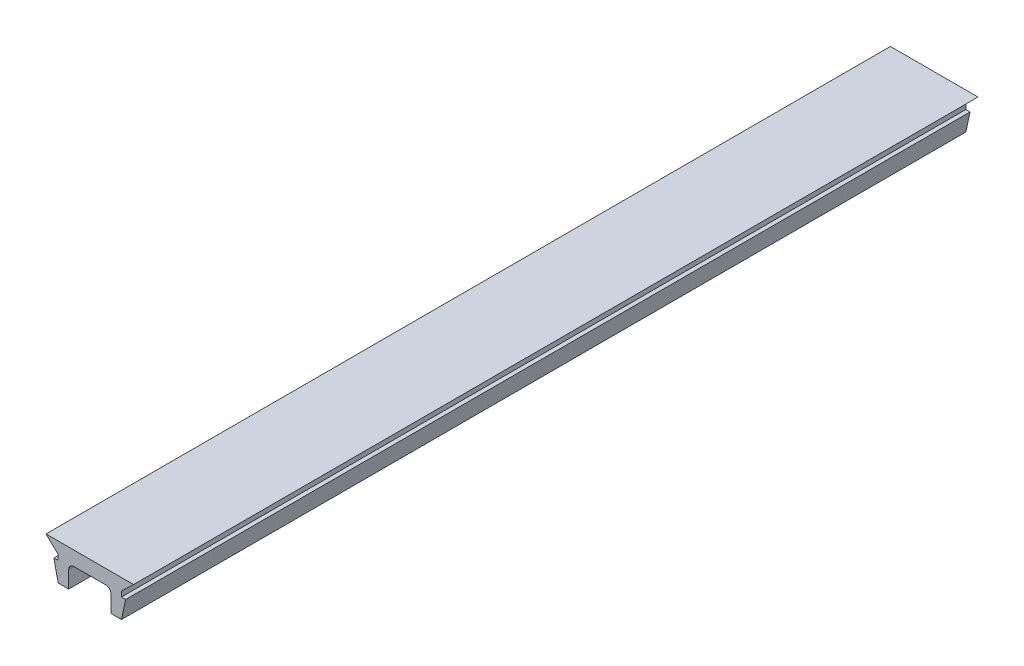
ISO-10303-21;
HEADER;
FILE_DESCRIPTION(('STEP AP214'),'2;1');
FILE_NAME('part.step','',(''),(''),'','','');
FILE_SCHEMA(('AUTOMOTIVE_DESIGN { 1 0 10303 214 1 1 1 1 }'));
ENDSEC;
DATA;
#1=APPLICATION_CONTEXT('core data for automotive mechanical design processes');
#2=APPLICATION_PROTOCOL_DEFINITION('international standard','automotive_design',2000,#1);
#3=PRODUCT_CONTEXT('',#1,'mechanical');
#4=PRODUCT('Part','Part','',(#3));
#5=PRODUCT_RELATED_PRODUCT_CATEGORY('part','',(#4));
#6=PRODUCT_DEFINITION_FORMATION('','',#4);
#7=PRODUCT_DEFINITION_CONTEXT('part definition',#1,'design');
#8=PRODUCT_DEFINITION('design','',#6,#7);
#9=PRODUCT_DEFINITION_SHAPE('','',#8);
#10=(LENGTH_UNIT() NAMED_UNIT(*) SI_UNIT(.MILLI.,.METRE.));
#11=(NAMED_UNIT(*) PLANE_ANGLE_UNIT() SI_UNIT($,.RADIAN.));
#12=(NAMED_UNIT(*) SI_UNIT($,.STERADIAN.) SOLID_ANGLE_UNIT());
#13=UNCERTAINTY_MEASURE_WITH_UNIT(LENGTH_MEASURE(1.E-05),#10,'distance_accuracy_value','');
#14=(GEOMETRIC_REPRESENTATION_CONTEXT(3) GLOBAL_UNCERTAINTY_ASSIGNED_CONTEXT((#13)) GLOBAL_UNIT_ASSIGNED_CONTEXT((#10,
#11,#12)) REPRESENTATION_CONTEXT('',''));
#15=CARTESIAN_POINT('',(0.,0.,0.));
#16=DIRECTION('',(0.,0.,1.));
#17=DIRECTION('',(1.,0.,0.));
#18=AXIS2_PLACEMENT_3D('',#15,#16,#17);
#19=CARTESIAN_POINT('',(-0.4,1.85,80.));
#20=DIRECTION('',(0.977414165439867,0.211332792527539,0.));
#21=DIRECTION('',(-0.211332792527539,0.977414165439867,0.));
#22=AXIS2_PLACEMENT_3D('',#19,#20,#21);
#23=PLANE('',#22);
#24=DIRECTION('',(0.211332792527539,-0.977414165439867,0.));
#25=VECTOR('',#24,1.);
#26=CARTESIAN_POINT('',(-0.4,1.85,0.));
#27=LINE('',#26,#25);
#28=CARTESIAN_POINT('',(-0.4,1.85,0.));
#29=VERTEX_POINT('',#28);
#30=CARTESIAN_POINT('',(0.,0.,0.));
#31=VERTEX_POINT('',#30);
#32=EDGE_CURVE('E188',#29,#31,#27,.T.);
#33=ORIENTED_EDGE('',*,*,#32,.T.);
#34=DIRECTION('',(0.,0.,-1.));
#35=VECTOR('',#34,1.);
#36=CARTESIAN_POINT('',(0.,0.,80.));
#37=LINE('',#36,#35);
#38=CARTESIAN_POINT('',(0.,0.,80.));
#39=VERTEX_POINT('',#38);
#40=EDGE_CURVE('E11',#39,#31,#37,.T.);
#41=ORIENTED_EDGE('',*,*,#40,.F.);
#42=DIRECTION('',(0.211332792527539,-0.977414165439867,0.));
#43=VECTOR('',#42,1.);
#44=CARTESIAN_POINT('',(-0.4,1.85,80.));
#45=LINE('',#44,#43);
#46=CARTESIAN_POINT('',(-0.4,1.85,80.));
#47=VERTEX_POINT('',#46);
#48=EDGE_CURVE('E235',#47,#39,#45,.T.);
#49=ORIENTED_EDGE('',*,*,#48,.F.);
#50=DIRECTION('',(0.,0.,-1.));
#51=VECTOR('',#50,1.);
#52=CARTESIAN_POINT('',(-0.4,1.85,80.));
#53=LINE('',#52,#51);
#54=EDGE_CURVE('E184',#47,#29,#53,.T.);
#55=ORIENTED_EDGE('',*,*,#54,.T.);
#56=EDGE_LOOP('',(#33,#41,#49,#55));
#57=FACE_BOUND('',#56,.T.);
#58=ADVANCED_FACE('F39',(#57),#23,.F.);
#59=CARTESIAN_POINT('',(0.,0.,80.));
#60=DIRECTION('',(0.,1.,0.));
#61=DIRECTION('',(0.,0.,1.));
#62=AXIS2_PLACEMENT_3D('',#59,#60,#61);
#63=PLANE('',#62);
#64=DIRECTION('',(1.,0.,0.));
#65=VECTOR('',#64,1.);
#66=CARTESIAN_POINT('',(0.,0.,0.));
#67=LINE('',#66,#65);
#68=CARTESIAN_POINT('',(1.,0.,0.));
#69=VERTEX_POINT('',#68);
#70=EDGE_CURVE('E192',#31,#69,#67,.T.);
#71=ORIENTED_EDGE('',*,*,#70,.T.);
#72=DIRECTION('',(0.,0.,-1.));
#73=VECTOR('',#72,1.);
#74=CARTESIAN_POINT('',(1.,0.,80.));
#75=LINE('',#74,#73);
#76=CARTESIAN_POINT('',(1.,0.,80.));
#77=VERTEX_POINT('',#76);
#78=EDGE_CURVE('E48',#77,#69,#75,.T.);
#79=ORIENTED_EDGE('',*,*,#78,.F.);
#80=DIRECTION('',(1.,0.,0.));
#81=VECTOR('',#80,1.);
#82=CARTESIAN_POINT('',(0.,0.,80.));
#83=LINE('',#82,#81);
#84=EDGE_CURVE('E123',#39,#77,#83,.T.);
#85=ORIENTED_EDGE('',*,*,#84,.F.);
#86=ORIENTED_EDGE('',*,*,#40,.T.);
#87=EDGE_LOOP('',(#71,#79,#85,#86));
#88=FACE_BOUND('',#87,.T.);
#89=ADVANCED_FACE('F356',(#88),#63,.F.);
#90=CARTESIAN_POINT('',(1.,0.,80.));
#91=DIRECTION('',(-1.,0.,0.));
#92=DIRECTION('',(0.,0.,1.));
#93=AXIS2_PLACEMENT_3D('',#90,#91,#92);
#94=PLANE('',#93);
#95=DIRECTION('',(0.,1.,0.));
#96=VECTOR('',#95,1.);
#97=CARTESIAN_POINT('',(1.,0.,0.));
#98=LINE('',#97,#96);
#99=CARTESIAN_POINT('',(1.,1.6,0.));
#100=VERTEX_POINT('',#99);
#101=EDGE_CURVE('E195',#69,#100,#98,.T.);
#102=ORIENTED_EDGE('',*,*,#101,.T.);
#103=DIRECTION('',(0.,0.,-1.));
#104=VECTOR('',#103,1.);
#105=CARTESIAN_POINT('',(1.,1.6,80.));
#106=LINE('',#105,#104);
#107=CARTESIAN_POINT('',(1.,1.6,80.));
#108=VERTEX_POINT('',#107);
#109=EDGE_CURVE('E278',#108,#100,#106,.T.);
#110=ORIENTED_EDGE('',*,*,#109,.F.);
#111=DIRECTION('',(0.,1.,0.));
#112=VECTOR('',#111,1.);
#113=CARTESIAN_POINT('',(1.,0.,80.));
#114=LINE('',#113,#112);
#115=EDGE_CURVE('E288',#77,#108,#114,.T.);
#116=ORIENTED_EDGE('',*,*,#115,.F.);
#117=ORIENTED_EDGE('',*,*,#78,.T.);
#118=EDGE_LOOP('',(#102,#110,#116,#117));
#119=FACE_BOUND('',#118,.T.);
#120=ADVANCED_FACE('F286',(#119),#94,.F.);
#121=CARTESIAN_POINT('',(1.5,1.6,80.));
#122=DIRECTION('',(0.,0.,-1.));
#123=DIRECTION('',(-1.,0.,0.));
#124=AXIS2_PLACEMENT_3D('',#121,#122,#123);
#125=CYLINDRICAL_SURFACE('',#124,0.5);
#126=CARTESIAN_POINT('',(1.5,1.6,0.));
#127=DIRECTION('',(0.,0.,-1.));
#128=DIRECTION('',(1.,0.,0.));
#129=AXIS2_PLACEMENT_3D('',#126,#127,#128);
#130=CIRCLE('',#129,0.5);
#131=CARTESIAN_POINT('',(1.5,2.1,0.));
#132=VERTEX_POINT('',#131);
#133=EDGE_CURVE('E198',#100,#132,#130,.T.);
#134=ORIENTED_EDGE('',*,*,#133,.T.);
#135=DIRECTION('',(0.,0.,-1.));
#136=VECTOR('',#135,1.);
#137=CARTESIAN_POINT('',(1.5,2.1,80.));
#138=LINE('',#137,#136);
#139=CARTESIAN_POINT('',(1.5,2.1,80.));
#140=VERTEX_POINT('',#139);
#141=EDGE_CURVE('E274',#140,#132,#138,.T.);
#142=ORIENTED_EDGE('',*,*,#141,.F.);
#143=CARTESIAN_POINT('',(1.5,1.6,80.));
#144=DIRECTION('',(0.,0.,-1.));
#145=DIRECTION('',(1.,0.,0.));
#146=AXIS2_PLACEMENT_3D('',#143,#144,#145);
#147=CIRCLE('',#146,0.5);
#148=EDGE_CURVE('E307',#108,#140,#147,.T.);
#149=ORIENTED_EDGE('',*,*,#148,.F.);
#150=ORIENTED_EDGE('',*,*,#109,.T.);
#151=EDGE_LOOP('',(#134,#142,#149,#150));
#152=FACE_BOUND('',#151,.T.);
#153=ADVANCED_FACE('F297',(#152),#125,.F.);
#154=CARTESIAN_POINT('',(1.5,2.1,80.));
#155=DIRECTION('',(0.,1.,0.));
#156=DIRECTION('',(0.,0.,1.));
#157=AXIS2_PLACEMENT_3D('',#154,#155,#156);
#158=PLANE('',#157);
#159=DIRECTION('',(1.,0.,0.));
#160=VECTOR('',#159,1.);
#161=CARTESIAN_POINT('',(1.5,2.1,0.));
#162=LINE('',#161,#160);
#163=CARTESIAN_POINT('',(4.5,2.1,0.));
#164=VERTEX_POINT('',#163);
#165=EDGE_CURVE('E201',#132,#164,#162,.T.);
#166=ORIENTED_EDGE('',*,*,#165,.T.);
#167=DIRECTION('',(0.,0.,-1.));
#168=VECTOR('',#167,1.);
#169=CARTESIAN_POINT('',(4.5,2.1,80.));
#170=LINE('',#169,#168);
#171=CARTESIAN_POINT('',(4.5,2.1,80.));
#172=VERTEX_POINT('',#171);
#173=EDGE_CURVE('E270',#172,#164,#170,.T.);
#174=ORIENTED_EDGE('',*,*,#173,.F.);
#175=DIRECTION('',(1.,0.,0.));
#176=VECTOR('',#175,1.);
#177=CARTESIAN_POINT('',(1.5,2.1,80.));
#178=LINE('',#177,#176);
#179=EDGE_CURVE('E303',#140,#172,#178,.T.);
#180=ORIENTED_EDGE('',*,*,#179,.F.);
#181=ORIENTED_EDGE('',*,*,#141,.T.);
#182=EDGE_LOOP('',(#166,#174,#180,#181));
#183=FACE_BOUND('',#182,.T.);
#184=ADVANCED_FACE('F301',(#183),#158,.F.);
#185=CARTESIAN_POINT('',(4.5,1.6,80.));
#186=DIRECTION('',(0.,0.,-1.));
#187=DIRECTION('',(-1.,0.,0.));
#188=AXIS2_PLACEMENT_3D('',#185,#186,#187);
#189=CYLINDRICAL_SURFACE('',#188,0.5);
#190=CARTESIAN_POINT('',(4.5,1.6,0.));
#191=DIRECTION('',(0.,0.,-1.));
#192=DIRECTION('',(-1.,0.,0.));
#193=AXIS2_PLACEMENT_3D('',#190,#191,#192);
#194=CIRCLE('',#193,0.5);
#195=CARTESIAN_POINT('',(5.,1.6,0.));
#196=VERTEX_POINT('',#195);
#197=EDGE_CURVE('E204',#164,#196,#194,.T.);
#198=ORIENTED_EDGE('',*,*,#197,.T.);
#199=DIRECTION('',(0.,0.,-1.));
#200=VECTOR('',#199,1.);
#201=CARTESIAN_POINT('',(5.,1.6,80.));
#202=LINE('',#201,#200);
#203=CARTESIAN_POINT('',(5.,1.6,80.));
#204=VERTEX_POINT('',#203);
#205=EDGE_CURVE('E266',#204,#196,#202,.T.);
#206=ORIENTED_EDGE('',*,*,#205,.F.);
#207=CARTESIAN_POINT('',(4.5,1.6,80.));
#208=DIRECTION('',(0.,0.,-1.));
#209=DIRECTION('',(-1.,0.,0.));
#210=AXIS2_PLACEMENT_3D('',#207,#208,#209);
#211=CIRCLE('',#210,0.5);
#212=EDGE_CURVE('E306',#172,#204,#211,.T.);
#213=ORIENTED_EDGE('',*,*,#212,.F.);
#214=ORIENTED_EDGE('',*,*,#173,.T.);
#215=EDGE_LOOP('',(#198,#206,#213,#214));
#216=FACE_BOUND('',#215,.T.);
#217=ADVANCED_FACE('F369',(#216),#189,.F.);
#218=CARTESIAN_POINT('',(5.,0.,80.));
#219=DIRECTION('',(1.,0.,0.));
#220=DIRECTION('',(0.,0.,-1.));
#221=AXIS2_PLACEMENT_3D('',#218,#219,#220);
#222=PLANE('',#221);
#223=DIRECTION('',(0.,-1.,0.));
#224=VECTOR('',#223,1.);
#225=CARTESIAN_POINT('',(5.,0.,0.));
#226=LINE('',#225,#224);
#227=CARTESIAN_POINT('',(5.,0.,0.));
#228=VERTEX_POINT('',#227);
#229=EDGE_CURVE('E207',#196,#228,#226,.T.);
#230=ORIENTED_EDGE('',*,*,#229,.T.);
#231=DIRECTION('',(0.,0.,-1.));
#232=VECTOR('',#231,1.);
#233=CARTESIAN_POINT('',(5.,0.,80.));
#234=LINE('',#233,#232);
#235=CARTESIAN_POINT('',(5.,0.,80.));
#236=VERTEX_POINT('',#235);
#237=EDGE_CURVE('E262',#236,#228,#234,.T.);
#238=ORIENTED_EDGE('',*,*,#237,.F.);
#239=DIRECTION('',(0.,-1.,0.));
#240=VECTOR('',#239,1.);
#241=CARTESIAN_POINT('',(5.,0.,80.));
#242=LINE('',#241,#240);
#243=EDGE_CURVE('E311',#204,#236,#242,.T.);
#244=ORIENTED_EDGE('',*,*,#243,.F.);
#245=ORIENTED_EDGE('',*,*,#205,.T.);
#246=EDGE_LOOP('',(#230,#238,#244,#245));
#247=FACE_BOUND('',#246,.T.);
#248=ADVANCED_FACE('F372',(#247),#222,.F.);
#249=CARTESIAN_POINT('',(5.,0.,80.));
#250=DIRECTION('',(0.,1.,0.));
#251=DIRECTION('',(0.,0.,1.));
#252=AXIS2_PLACEMENT_3D('',#249,#250,#251);
#253=PLANE('',#252);
#254=DIRECTION('',(1.,0.,0.));
#255=VECTOR('',#254,1.);
#256=CARTESIAN_POINT('',(5.,0.,0.));
#257=LINE('',#256,#255);
#258=CARTESIAN_POINT('',(6.,0.,0.));
#259=VERTEX_POINT('',#258);
#260=EDGE_CURVE('E210',#228,#259,#257,.T.);
#261=ORIENTED_EDGE('',*,*,#260,.T.);
#262=DIRECTION('',(0.,0.,-1.));
#263=VECTOR('',#262,1.);
#264=CARTESIAN_POINT('',(6.,0.,80.));
#265=LINE('',#264,#263);
#266=CARTESIAN_POINT('',(6.,0.,80.));
#267=VERTEX_POINT('',#266);
#268=EDGE_CURVE('E258',#267,#259,#265,.T.);
#269=ORIENTED_EDGE('',*,*,#268,.F.);
#270=DIRECTION('',(1.,0.,0.));
#271=VECTOR('',#270,1.);
#272=CARTESIAN_POINT('',(5.,0.,80.));
#273=LINE('',#272,#271);
#274=EDGE_CURVE('E318',#236,#267,#273,.T.);
#275=ORIENTED_EDGE('',*,*,#274,.F.);
#276=ORIENTED_EDGE('',*,*,#237,.T.);
#277=EDGE_LOOP('',(#261,#269,#275,#276));
#278=FACE_BOUND('',#277,.T.);
#279=ADVANCED_FACE('F376',(#278),#253,.F.);
#280=CARTESIAN_POINT('',(6.,0.,80.));
#281=DIRECTION('',(-0.977414165439867,0.211332792527539,0.));
#282=DIRECTION('',(-0.211332792527539,-0.977414165439867,0.));
#283=AXIS2_PLACEMENT_3D('',#280,#281,#282);
#284=PLANE('',#283);
#285=DIRECTION('',(0.211332792527539,0.977414165439867,0.));
#286=VECTOR('',#285,1.);
#287=CARTESIAN_POINT('',(6.,0.,0.));
#288=LINE('',#287,#286);
#289=CARTESIAN_POINT('',(6.4,1.85,0.));
#290=VERTEX_POINT('',#289);
#291=EDGE_CURVE('E213',#259,#290,#288,.T.);
#292=ORIENTED_EDGE('',*,*,#291,.T.);
#293=DIRECTION('',(0.,0.,-1.));
#294=VECTOR('',#293,1.);
#295=CARTESIAN_POINT('',(6.4,1.85,80.));
#296=LINE('',#295,#294);
#297=CARTESIAN_POINT('',(6.4,1.85,80.));
#298=VERTEX_POINT('',#297);
#299=EDGE_CURVE('E254',#298,#290,#296,.T.);
#300=ORIENTED_EDGE('',*,*,#299,.F.);
#301=DIRECTION('',(0.211332792527539,0.977414165439867,0.));
#302=VECTOR('',#301,1.);
#303=CARTESIAN_POINT('',(6.,0.,80.));
#304=LINE('',#303,#302);
#305=EDGE_CURVE('E321',#267,#298,#304,.T.);
#306=ORIENTED_EDGE('',*,*,#305,.F.);
#307=ORIENTED_EDGE('',*,*,#268,.T.);
#308=EDGE_LOOP('',(#292,#300,#306,#307));
#309=FACE_BOUND('',#308,.T.);
#310=ADVANCED_FACE('F380',(#309),#284,.F.);
#311=CARTESIAN_POINT('',(6.4,1.85,80.));
#312=DIRECTION('',(0.,-1.,0.));
#313=DIRECTION('',(1.,0.,0.));
#314=AXIS2_PLACEMENT_3D('',#311,#312,#313);
#315=PLANE('',#314);
#316=DIRECTION('',(-1.,0.,0.));
#317=VECTOR('',#316,1.);
#318=CARTESIAN_POINT('',(6.4,1.85,0.));
#319=LINE('',#318,#317);
#320=CARTESIAN_POINT('',(6.,1.85,0.));
#321=VERTEX_POINT('',#320);
#322=EDGE_CURVE('E216',#290,#321,#319,.T.);
#323=ORIENTED_EDGE('',*,*,#322,.T.);
#324=DIRECTION('',(0.,0.,-1.));
#325=VECTOR('',#324,1.);
#326=CARTESIAN_POINT('',(6.,1.85,80.));
#327=LINE('',#326,#325);
#328=CARTESIAN_POINT('',(6.,1.85,80.));
#329=VERTEX_POINT('',#328);
#330=EDGE_CURVE('E250',#329,#321,#327,.T.);
#331=ORIENTED_EDGE('',*,*,#330,.F.);
#332=DIRECTION('',(-1.,0.,0.));
#333=VECTOR('',#332,1.);
#334=CARTESIAN_POINT('',(6.4,1.85,80.));
#335=LINE('',#334,#333);
#336=EDGE_CURVE('E324',#298,#329,#335,.T.);
#337=ORIENTED_EDGE('',*,*,#336,.F.);
#338=ORIENTED_EDGE('',*,*,#299,.T.);
#339=EDGE_LOOP('',(#323,#331,#337,#338));
#340=FACE_BOUND('',#339,.T.);
#341=ADVANCED_FACE('F384',(#340),#315,.F.);
#342=CARTESIAN_POINT('',(6.,1.85,80.));
#343=DIRECTION('',(-1.,0.,0.));
#344=DIRECTION('',(0.,-1.,0.));
#345=AXIS2_PLACEMENT_3D('',#342,#343,#344);
#346=PLANE('',#345);
#347=DIRECTION('',(0.,1.,0.));
#348=VECTOR('',#347,1.);
#349=CARTESIAN_POINT('',(6.,1.85,0.));
#350=LINE('',#349,#348);
#351=CARTESIAN_POINT('',(6.,2.35,0.));
#352=VERTEX_POINT('',#351);
#353=EDGE_CURVE('E219',#321,#352,#350,.T.);
#354=ORIENTED_EDGE('',*,*,#353,.T.);
#355=DIRECTION('',(0.,0.,-1.));
#356=VECTOR('',#355,1.);
#357=CARTESIAN_POINT('',(6.,2.35,80.));
#358=LINE('',#357,#356);
#359=CARTESIAN_POINT('',(6.,2.35,80.));
#360=VERTEX_POINT('',#359);
#361=EDGE_CURVE('E246',#360,#352,#358,.T.);
#362=ORIENTED_EDGE('',*,*,#361,.F.);
#363=DIRECTION('',(0.,1.,0.));
#364=VECTOR('',#363,1.);
#365=CARTESIAN_POINT('',(6.,1.85,80.));
#366=LINE('',#365,#364);
#367=EDGE_CURVE('E327',#329,#360,#366,.T.);
#368=ORIENTED_EDGE('',*,*,#367,.F.);
#369=ORIENTED_EDGE('',*,*,#330,.T.);
#370=EDGE_LOOP('',(#354,#362,#368,#369));
#371=FACE_BOUND('',#370,.T.);
#372=ADVANCED_FACE('F388',(#371),#346,.F.);
#373=CARTESIAN_POINT('',(7.15,3.45,80.));
#374=DIRECTION('',(-0.691222645967364,0.722641857147699,0.));
#375=DIRECTION('',(-0.722641857147699,-0.691222645967364,0.));
#376=AXIS2_PLACEMENT_3D('',#373,#374,#375);
#377=PLANE('',#376);
#378=DIRECTION('',(0.722641857147699,0.691222645967364,0.));
#379=VECTOR('',#378,1.);
#380=CARTESIAN_POINT('',(7.15,3.45,0.));
#381=LINE('',#380,#379);
#382=CARTESIAN_POINT('',(7.15,3.45,0.));
#383=VERTEX_POINT('',#382);
#384=EDGE_CURVE('E222',#352,#383,#381,.T.);
#385=ORIENTED_EDGE('',*,*,#384,.T.);
#386=DIRECTION('',(0.,0.,-1.));
#387=VECTOR('',#386,1.);
#388=CARTESIAN_POINT('',(7.15,3.45,80.));
#389=LINE('',#388,#387);
#390=CARTESIAN_POINT('',(7.15,3.45,80.));
#391=VERTEX_POINT('',#390);
#392=EDGE_CURVE('E242',#391,#383,#389,.T.);
#393=ORIENTED_EDGE('',*,*,#392,.F.);
#394=DIRECTION('',(0.722641857147699,0.691222645967364,0.));
#395=VECTOR('',#394,1.);
#396=CARTESIAN_POINT('',(7.15,3.45,80.));
#397=LINE('',#396,#395);
#398=EDGE_CURVE('E330',#360,#391,#397,.T.);
#399=ORIENTED_EDGE('',*,*,#398,.F.);
#400=ORIENTED_EDGE('',*,*,#361,.T.);
#401=EDGE_LOOP('',(#385,#393,#399,#400));
#402=FACE_BOUND('',#401,.T.);
#403=ADVANCED_FACE('F338',(#402),#377,.F.);
#404=CARTESIAN_POINT('',(-1.15,3.45,80.));
#405=DIRECTION('',(0.,-1.,0.));
#406=DIRECTION('',(1.,0.,0.));
#407=AXIS2_PLACEMENT_3D('',#404,#405,#406);
#408=PLANE('',#407);
#409=DIRECTION('',(-1.,0.,0.));
#410=VECTOR('',#409,1.);
#411=CARTESIAN_POINT('',(-1.15,3.45,0.));
#412=LINE('',#411,#410);
#413=CARTESIAN_POINT('',(-1.15,3.45,0.));
#414=VERTEX_POINT('',#413);
#415=EDGE_CURVE('E226',#383,#414,#412,.T.);
#416=ORIENTED_EDGE('',*,*,#415,.T.);
#417=DIRECTION('',(0.,0.,-1.));
#418=VECTOR('',#417,1.);
#419=CARTESIAN_POINT('',(-1.15,3.45,80.));
#420=LINE('',#419,#418);
#421=CARTESIAN_POINT('',(-1.15,3.45,80.));
#422=VERTEX_POINT('',#421);
#423=EDGE_CURVE('E177',#422,#414,#420,.T.);
#424=ORIENTED_EDGE('',*,*,#423,.F.);
#425=DIRECTION('',(-1.,0.,0.));
#426=VECTOR('',#425,1.);
#427=CARTESIAN_POINT('',(6.,3.45,80.));
#428=LINE('',#427,#426);
#429=EDGE_CURVE('E166',#391,#422,#428,.T.);
#430=ORIENTED_EDGE('',*,*,#429,.F.);
#431=ORIENTED_EDGE('',*,*,#392,.T.);
#432=EDGE_LOOP('',(#416,#424,#430,#431));
#433=FACE_BOUND('',#432,.T.);
#434=ADVANCED_FACE('F341',(#433),#408,.F.);
#435=CARTESIAN_POINT('',(0.,2.35,80.));
#436=DIRECTION('',(0.691222645967365,0.722641857147699,0.));
#437=DIRECTION('',(-0.722641857147699,0.691222645967365,0.));
#438=AXIS2_PLACEMENT_3D('',#435,#436,#437);
#439=PLANE('',#438);
#440=DIRECTION('',(0.722641857147699,-0.691222645967365,0.));
#441=VECTOR('',#440,1.);
#442=CARTESIAN_POINT('',(0.,2.35,0.));
#443=LINE('',#442,#441);
#444=CARTESIAN_POINT('',(0.,2.35,0.));
#445=VERTEX_POINT('',#444);
#446=EDGE_CURVE('E175',#414,#445,#443,.T.);
#447=ORIENTED_EDGE('',*,*,#446,.T.);
#448=DIRECTION('',(0.,0.,-1.));
#449=VECTOR('',#448,1.);
#450=CARTESIAN_POINT('',(0.,2.35,80.));
#451=LINE('',#450,#449);
#452=CARTESIAN_POINT('',(0.,2.35,80.));
#453=VERTEX_POINT('',#452);
#454=EDGE_CURVE('E172',#453,#445,#451,.T.);
#455=ORIENTED_EDGE('',*,*,#454,.F.);
#456=DIRECTION('',(0.722641857147699,-0.691222645967365,0.));
#457=VECTOR('',#456,1.);
#458=CARTESIAN_POINT('',(0.,2.35,80.));
#459=LINE('',#458,#457);
#460=EDGE_CURVE('E160',#422,#453,#459,.T.);
#461=ORIENTED_EDGE('',*,*,#460,.F.);
#462=ORIENTED_EDGE('',*,*,#423,.T.);
#463=EDGE_LOOP('',(#447,#455,#461,#462));
#464=FACE_BOUND('',#463,.T.);
#465=ADVANCED_FACE('F173',(#464),#439,.F.);
#466=CARTESIAN_POINT('',(0.,1.85,80.));
#467=DIRECTION('',(1.,0.,0.));
#468=DIRECTION('',(0.,0.,-1.));
#469=AXIS2_PLACEMENT_3D('',#466,#467,#468);
#470=PLANE('',#469);
#471=DIRECTION('',(0.,-1.,0.));
#472=VECTOR('',#471,1.);
#473=CARTESIAN_POINT('',(0.,1.85,0.));
#474=LINE('',#473,#472);
#475=CARTESIAN_POINT('',(0.,1.85,0.));
#476=VERTEX_POINT('',#475);
#477=EDGE_CURVE('E109',#445,#476,#474,.T.);
#478=ORIENTED_EDGE('',*,*,#477,.T.);
#479=DIRECTION('',(0.,0.,-1.));
#480=VECTOR('',#479,1.);
#481=CARTESIAN_POINT('',(0.,1.85,80.));
#482=LINE('',#481,#480);
#483=CARTESIAN_POINT('',(0.,1.85,80.));
#484=VERTEX_POINT('',#483);
#485=EDGE_CURVE('E178',#484,#476,#482,.T.);
#486=ORIENTED_EDGE('',*,*,#485,.F.);
#487=DIRECTION('',(0.,-1.,0.));
#488=VECTOR('',#487,1.);
#489=CARTESIAN_POINT('',(0.,1.85,80.));
#490=LINE('',#489,#488);
#491=EDGE_CURVE('E164',#453,#484,#490,.T.);
#492=ORIENTED_EDGE('',*,*,#491,.F.);
#493=ORIENTED_EDGE('',*,*,#454,.T.);
#494=EDGE_LOOP('',(#478,#486,#492,#493));
#495=FACE_BOUND('',#494,.T.);
#496=ADVANCED_FACE('F180',(#495),#470,.F.);
#497=CARTESIAN_POINT('',(0.,1.85,80.));
#498=DIRECTION('',(0.,-1.,0.));
#499=DIRECTION('',(1.,0.,0.));
#500=AXIS2_PLACEMENT_3D('',#497,#498,#499);
#501=PLANE('',#500);
#502=DIRECTION('',(-1.,0.,0.));
#503=VECTOR('',#502,1.);
#504=CARTESIAN_POINT('',(0.,1.85,0.));
#505=LINE('',#504,#503);
#506=EDGE_CURVE('E115',#476,#29,#505,.T.);
#507=ORIENTED_EDGE('',*,*,#506,.T.);
#508=ORIENTED_EDGE('',*,*,#54,.F.);
#509=DIRECTION('',(-1.,0.,0.));
#510=VECTOR('',#509,1.);
#511=CARTESIAN_POINT('',(0.,1.85,80.));
#512=LINE('',#511,#510);
#513=EDGE_CURVE('E56',#484,#47,#512,.T.);
#514=ORIENTED_EDGE('',*,*,#513,.F.);
#515=ORIENTED_EDGE('',*,*,#485,.T.);
#516=EDGE_LOOP('',(#507,#508,#514,#515));
#517=FACE_BOUND('',#516,.T.);
#518=ADVANCED_FACE('F345',(#517),#501,.F.);
#519=CARTESIAN_POINT('',(1.5,1.6,80.));
#520=DIRECTION('',(0.,0.,1.));
#521=DIRECTION('',(1.,0.,0.));
#522=AXIS2_PLACEMENT_3D('',#519,#520,#521);
#523=PLANE('',#522);
#524=ORIENTED_EDGE('',*,*,#48,.T.);
#525=ORIENTED_EDGE('',*,*,#84,.T.);
#526=ORIENTED_EDGE('',*,*,#115,.T.);
#527=ORIENTED_EDGE('',*,*,#148,.T.);
#528=ORIENTED_EDGE('',*,*,#179,.T.);
#529=ORIENTED_EDGE('',*,*,#212,.T.);
#530=ORIENTED_EDGE('',*,*,#243,.T.);
#531=ORIENTED_EDGE('',*,*,#274,.T.);
#532=ORIENTED_EDGE('',*,*,#305,.T.);
#533=ORIENTED_EDGE('',*,*,#336,.T.);
#534=ORIENTED_EDGE('',*,*,#367,.T.);
#535=ORIENTED_EDGE('',*,*,#398,.T.);
#536=ORIENTED_EDGE('',*,*,#429,.T.);
#537=ORIENTED_EDGE('',*,*,#460,.T.);
#538=ORIENTED_EDGE('',*,*,#491,.T.);
#539=ORIENTED_EDGE('',*,*,#513,.T.);
#540=EDGE_LOOP('',(#524,#525,#526,#527,#528,#529,#530,#531,#532,#533,#534,#535,#536,#537,#538,#539));
#541=FACE_BOUND('',#540,.T.);
#542=ADVANCED_FACE('F162',(#541),#523,.T.);
#543=CARTESIAN_POINT('',(1.5,1.6,0.));
#544=DIRECTION('',(0.,0.,1.));
#545=DIRECTION('',(1.,0.,0.));
#546=AXIS2_PLACEMENT_3D('',#543,#544,#545);
#547=PLANE('',#546);
#548=ORIENTED_EDGE('',*,*,#32,.F.);
#549=ORIENTED_EDGE('',*,*,#506,.F.);
#550=ORIENTED_EDGE('',*,*,#477,.F.);
#551=ORIENTED_EDGE('',*,*,#446,.F.);
#552=ORIENTED_EDGE('',*,*,#415,.F.);
#553=ORIENTED_EDGE('',*,*,#384,.F.);
#554=ORIENTED_EDGE('',*,*,#353,.F.);
#555=ORIENTED_EDGE('',*,*,#322,.F.);
#556=ORIENTED_EDGE('',*,*,#291,.F.);
#557=ORIENTED_EDGE('',*,*,#260,.F.);
#558=ORIENTED_EDGE('',*,*,#229,.F.);
#559=ORIENTED_EDGE('',*,*,#197,.F.);
#560=ORIENTED_EDGE('',*,*,#165,.F.);
#561=ORIENTED_EDGE('',*,*,#133,.F.);
#562=ORIENTED_EDGE('',*,*,#101,.F.);
#563=ORIENTED_EDGE('',*,*,#70,.F.);
#564=EDGE_LOOP('',(#548,#549,#550,#551,#552,#553,#554,#555,#556,#557,#558,#559,#560,#561,#562,#563));
#565=FACE_BOUND('',#564,.T.);
#566=ADVANCED_FACE('F292',(#565),#547,.F.);
#567=CLOSED_SHELL('',(#58,#89,#120,#153,#184,#217,#248,#279,#310,#341,#372,#403,#434,#465,#496,
#518,#542,#566));
#568=MANIFOLD_SOLID_BREP('B2',#567);
#569=ADVANCED_BREP_SHAPE_REPRESENTATION('',(#18,#568),#14);
#570=SHAPE_DEFINITION_REPRESENTATION(#9,#569);
ENDSEC;
END-ISO-10303-21;
